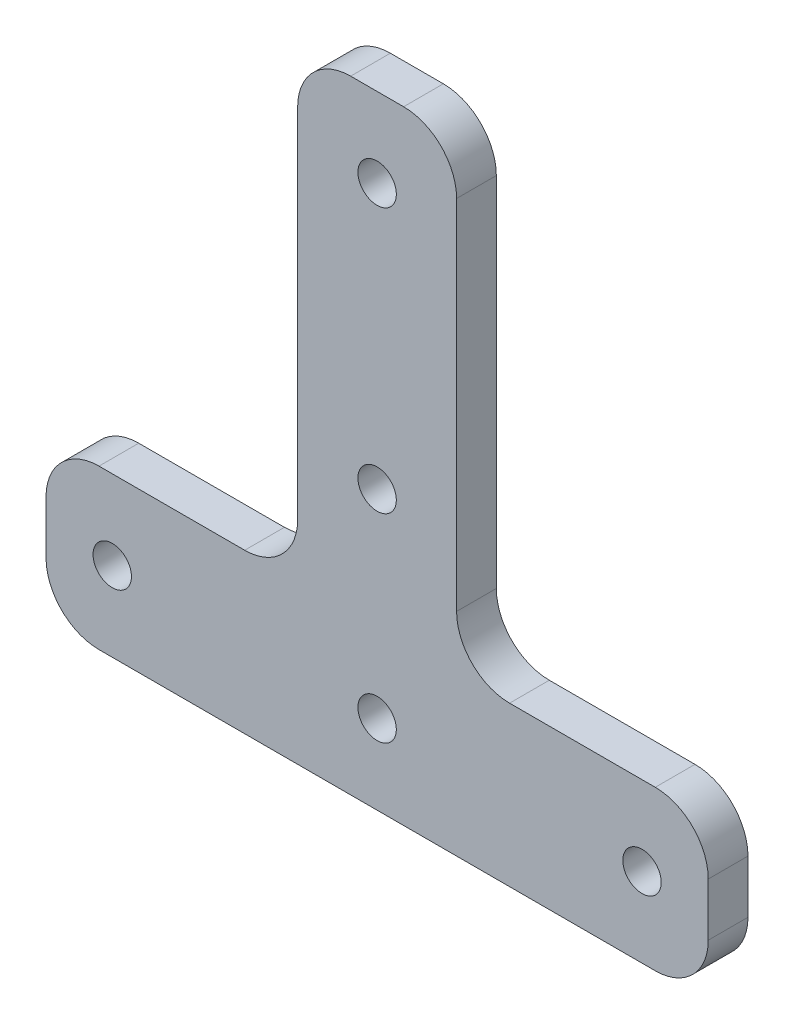
ISO-10303-21;
HEADER;
FILE_DESCRIPTION(('STEP AP214'),'2;1');
FILE_NAME('part.step','',(''),(''),'','','');
FILE_SCHEMA(('AUTOMOTIVE_DESIGN { 1 0 10303 214 1 1 1 1 }'));
ENDSEC;
DATA;
#1=APPLICATION_CONTEXT('core data for automotive mechanical design processes');
#2=APPLICATION_PROTOCOL_DEFINITION('international standard','automotive_design',2000,#1);
#3=PRODUCT_CONTEXT('',#1,'mechanical');
#4=PRODUCT('Part','Part','',(#3));
#5=PRODUCT_RELATED_PRODUCT_CATEGORY('part','',(#4));
#6=PRODUCT_DEFINITION_FORMATION('','',#4);
#7=PRODUCT_DEFINITION_CONTEXT('part definition',#1,'design');
#8=PRODUCT_DEFINITION('design','',#6,#7);
#9=PRODUCT_DEFINITION_SHAPE('','',#8);
#10=(LENGTH_UNIT() NAMED_UNIT(*) SI_UNIT(.MILLI.,.METRE.));
#11=(NAMED_UNIT(*) PLANE_ANGLE_UNIT() SI_UNIT($,.RADIAN.));
#12=(NAMED_UNIT(*) SI_UNIT($,.STERADIAN.) SOLID_ANGLE_UNIT());
#13=UNCERTAINTY_MEASURE_WITH_UNIT(LENGTH_MEASURE(1.E-05),#10,'distance_accuracy_value','');
#14=(GEOMETRIC_REPRESENTATION_CONTEXT(3) GLOBAL_UNCERTAINTY_ASSIGNED_CONTEXT((#13)) GLOBAL_UNIT_ASSIGNED_CONTEXT((#10,
#11,#12)) REPRESENTATION_CONTEXT('',''));
#15=CARTESIAN_POINT('',(0.,0.,0.));
#16=DIRECTION('',(0.,0.,1.));
#17=DIRECTION('',(1.,0.,0.));
#18=AXIS2_PLACEMENT_3D('',#15,#16,#17);
#19=CARTESIAN_POINT('',(0.,0.,3.));
#20=DIRECTION('',(0.,0.,-1.));
#21=DIRECTION('',(-1.,0.,0.));
#22=AXIS2_PLACEMENT_3D('',#19,#20,#21);
#23=PLANE('',#22);
#24=DIRECTION('',(-1.,0.,0.));
#25=VECTOR('',#24,1.);
#26=CARTESIAN_POINT('',(6.,41.,3.));
#27=LINE('',#26,#25);
#28=CARTESIAN_POINT('',(2.,41.,3.));
#29=VERTEX_POINT('',#28);
#30=CARTESIAN_POINT('',(-2.,41.,3.));
#31=VERTEX_POINT('',#30);
#32=EDGE_CURVE('E202',#29,#31,#27,.T.);
#33=ORIENTED_EDGE('',*,*,#32,.T.);
#34=CARTESIAN_POINT('',(-2.,37.,3.));
#35=DIRECTION('',(0.,0.,-1.));
#36=DIRECTION('',(-1.,0.,0.));
#37=AXIS2_PLACEMENT_3D('',#34,#35,#36);
#38=CIRCLE('',#37,4.);
#39=CARTESIAN_POINT('',(-6.,37.,3.));
#40=VERTEX_POINT('',#39);
#41=EDGE_CURVE('E261',#31,#40,#38,.F.);
#42=ORIENTED_EDGE('',*,*,#41,.T.);
#43=DIRECTION('',(0.,-1.,0.));
#44=VECTOR('',#43,1.);
#45=CARTESIAN_POINT('',(-6.,41.,3.));
#46=LINE('',#45,#44);
#47=CARTESIAN_POINT('',(-5.99999999999999,10.,3.));
#48=VERTEX_POINT('',#47);
#49=EDGE_CURVE('E180',#40,#48,#46,.T.);
#50=ORIENTED_EDGE('',*,*,#49,.T.);
#51=CARTESIAN_POINT('',(-9.99999999999999,10.,3.));
#52=DIRECTION('',(0.,0.,-1.));
#53=DIRECTION('',(-1.,0.,0.));
#54=AXIS2_PLACEMENT_3D('',#51,#52,#53);
#55=CIRCLE('',#54,4.);
#56=CARTESIAN_POINT('',(-9.99999999999999,6.,3.));
#57=VERTEX_POINT('',#56);
#58=EDGE_CURVE('E307',#48,#57,#55,.T.);
#59=ORIENTED_EDGE('',*,*,#58,.T.);
#60=DIRECTION('',(-1.,0.,0.));
#61=VECTOR('',#60,1.);
#62=CARTESIAN_POINT('',(-5.99999999999999,6.,3.));
#63=LINE('',#62,#61);
#64=CARTESIAN_POINT('',(-21.,5.99999999999999,3.));
#65=VERTEX_POINT('',#64);
#66=EDGE_CURVE('E341',#57,#65,#63,.T.);
#67=ORIENTED_EDGE('',*,*,#66,.T.);
#68=CARTESIAN_POINT('',(-21.,1.99999999999999,3.));
#69=DIRECTION('',(0.,0.,-1.));
#70=DIRECTION('',(-1.,0.,0.));
#71=AXIS2_PLACEMENT_3D('',#68,#69,#70);
#72=CIRCLE('',#71,4.);
#73=CARTESIAN_POINT('',(-25.,1.99999999999999,3.));
#74=VERTEX_POINT('',#73);
#75=EDGE_CURVE('E246',#65,#74,#72,.F.);
#76=ORIENTED_EDGE('',*,*,#75,.T.);
#77=DIRECTION('',(0.,-1.,0.));
#78=VECTOR('',#77,1.);
#79=CARTESIAN_POINT('',(-25.,5.99999999999999,3.));
#80=LINE('',#79,#78);
#81=CARTESIAN_POINT('',(-25.,-2.00000000000001,3.));
#82=VERTEX_POINT('',#81);
#83=EDGE_CURVE('E337',#74,#82,#80,.T.);
#84=ORIENTED_EDGE('',*,*,#83,.T.);
#85=CARTESIAN_POINT('',(-21.,-2.00000000000001,3.));
#86=DIRECTION('',(0.,0.,-1.));
#87=DIRECTION('',(-1.,0.,0.));
#88=AXIS2_PLACEMENT_3D('',#85,#86,#87);
#89=CIRCLE('',#88,4.);
#90=CARTESIAN_POINT('',(-21.,-6.00000000000001,3.));
#91=VERTEX_POINT('',#90);
#92=EDGE_CURVE('E249',#82,#91,#89,.F.);
#93=ORIENTED_EDGE('',*,*,#92,.T.);
#94=DIRECTION('',(1.,0.,0.));
#95=VECTOR('',#94,1.);
#96=CARTESIAN_POINT('',(-25.,-6.00000000000001,3.));
#97=LINE('',#96,#95);
#98=CARTESIAN_POINT('',(21.,-6.00000000000001,3.));
#99=VERTEX_POINT('',#98);
#100=EDGE_CURVE('E333',#91,#99,#97,.T.);
#101=ORIENTED_EDGE('',*,*,#100,.T.);
#102=CARTESIAN_POINT('',(21.,-2.00000000000001,3.));
#103=DIRECTION('',(0.,0.,-1.));
#104=DIRECTION('',(-1.,0.,0.));
#105=AXIS2_PLACEMENT_3D('',#102,#103,#104);
#106=CIRCLE('',#105,4.);
#107=CARTESIAN_POINT('',(25.,-2.00000000000001,3.));
#108=VERTEX_POINT('',#107);
#109=EDGE_CURVE('E252',#99,#108,#106,.F.);
#110=ORIENTED_EDGE('',*,*,#109,.T.);
#111=DIRECTION('',(0.,1.,0.));
#112=VECTOR('',#111,1.);
#113=CARTESIAN_POINT('',(25.,-6.00000000000001,3.));
#114=LINE('',#113,#112);
#115=CARTESIAN_POINT('',(25.,2.,3.));
#116=VERTEX_POINT('',#115);
#117=EDGE_CURVE('E327',#108,#116,#114,.T.);
#118=ORIENTED_EDGE('',*,*,#117,.T.);
#119=CARTESIAN_POINT('',(21.,2.,3.));
#120=DIRECTION('',(0.,0.,-1.));
#121=DIRECTION('',(-1.,0.,0.));
#122=AXIS2_PLACEMENT_3D('',#119,#120,#121);
#123=CIRCLE('',#122,4.);
#124=CARTESIAN_POINT('',(21.,6.,3.));
#125=VERTEX_POINT('',#124);
#126=EDGE_CURVE('E255',#116,#125,#123,.F.);
#127=ORIENTED_EDGE('',*,*,#126,.T.);
#128=DIRECTION('',(-1.,0.,0.));
#129=VECTOR('',#128,1.);
#130=CARTESIAN_POINT('',(25.,6.,3.));
#131=LINE('',#130,#129);
#132=CARTESIAN_POINT('',(10.,6.,3.));
#133=VERTEX_POINT('',#132);
#134=EDGE_CURVE('E323',#125,#133,#131,.T.);
#135=ORIENTED_EDGE('',*,*,#134,.T.);
#136=CARTESIAN_POINT('',(10.,10.,3.));
#137=DIRECTION('',(0.,0.,-1.));
#138=DIRECTION('',(-1.,0.,0.));
#139=AXIS2_PLACEMENT_3D('',#136,#137,#138);
#140=CIRCLE('',#139,4.);
#141=CARTESIAN_POINT('',(6.,10.,3.));
#142=VERTEX_POINT('',#141);
#143=EDGE_CURVE('E11',#133,#142,#140,.T.);
#144=ORIENTED_EDGE('',*,*,#143,.T.);
#145=DIRECTION('',(0.,1.,0.));
#146=VECTOR('',#145,1.);
#147=CARTESIAN_POINT('',(6.,6.,3.));
#148=LINE('',#147,#146);
#149=CARTESIAN_POINT('',(6.,37.,3.));
#150=VERTEX_POINT('',#149);
#151=EDGE_CURVE('E320',#142,#150,#148,.T.);
#152=ORIENTED_EDGE('',*,*,#151,.T.);
#153=CARTESIAN_POINT('',(2.,37.,3.));
#154=DIRECTION('',(0.,0.,-1.));
#155=DIRECTION('',(-1.,0.,0.));
#156=AXIS2_PLACEMENT_3D('',#153,#154,#155);
#157=CIRCLE('',#156,4.);
#158=EDGE_CURVE('E258',#150,#29,#157,.F.);
#159=ORIENTED_EDGE('',*,*,#158,.T.);
#160=EDGE_LOOP('',(#33,#42,#50,#59,#67,#76,#84,#93,#101,#110,#118,#127,#135,#144,#152,#159));
#161=FACE_BOUND('',#160,.T.);
#162=CARTESIAN_POINT('',(0.,35.,3.));
#163=DIRECTION('',(0.,0.,1.));
#164=DIRECTION('',(1.,0.,0.));
#165=AXIS2_PLACEMENT_3D('',#162,#163,#164);
#166=CIRCLE('',#165,1.45);
#167=CARTESIAN_POINT('',(1.45,35.,3.));
#168=VERTEX_POINT('',#167);
#169=EDGE_CURVE('E191',#168,#168,#166,.T.);
#170=ORIENTED_EDGE('',*,*,#169,.F.);
#171=EDGE_LOOP('',(#170));
#172=FACE_BOUND('',#171,.T.);
#173=CARTESIAN_POINT('',(0.,0.,3.));
#174=DIRECTION('',(0.,0.,1.));
#175=DIRECTION('',(1.,0.,0.));
#176=AXIS2_PLACEMENT_3D('',#173,#174,#175);
#177=CIRCLE('',#176,1.45);
#178=CARTESIAN_POINT('',(1.45,0.,3.));
#179=VERTEX_POINT('',#178);
#180=EDGE_CURVE('E349',#179,#179,#177,.T.);
#181=ORIENTED_EDGE('',*,*,#180,.F.);
#182=EDGE_LOOP('',(#181));
#183=FACE_BOUND('',#182,.T.);
#184=CARTESIAN_POINT('',(-20.,0.,3.));
#185=DIRECTION('',(0.,0.,1.));
#186=DIRECTION('',(1.,0.,0.));
#187=AXIS2_PLACEMENT_3D('',#184,#185,#186);
#188=CIRCLE('',#187,1.45);
#189=CARTESIAN_POINT('',(-18.55,0.,3.));
#190=VERTEX_POINT('',#189);
#191=EDGE_CURVE('E355',#190,#190,#188,.T.);
#192=ORIENTED_EDGE('',*,*,#191,.F.);
#193=EDGE_LOOP('',(#192));
#194=FACE_BOUND('',#193,.T.);
#195=CARTESIAN_POINT('',(20.,0.,3.));
#196=DIRECTION('',(0.,0.,1.));
#197=DIRECTION('',(1.,0.,0.));
#198=AXIS2_PLACEMENT_3D('',#195,#196,#197);
#199=CIRCLE('',#198,1.45);
#200=CARTESIAN_POINT('',(21.45,0.,3.));
#201=VERTEX_POINT('',#200);
#202=EDGE_CURVE('E363',#201,#201,#199,.T.);
#203=ORIENTED_EDGE('',*,*,#202,.F.);
#204=EDGE_LOOP('',(#203));
#205=FACE_BOUND('',#204,.T.);
#206=CARTESIAN_POINT('',(0.,15.,3.));
#207=DIRECTION('',(0.,0.,1.));
#208=DIRECTION('',(1.,0.,0.));
#209=AXIS2_PLACEMENT_3D('',#206,#207,#208);
#210=CIRCLE('',#209,1.45);
#211=CARTESIAN_POINT('',(1.45,15.,3.));
#212=VERTEX_POINT('',#211);
#213=EDGE_CURVE('E371',#212,#212,#210,.T.);
#214=ORIENTED_EDGE('',*,*,#213,.F.);
#215=EDGE_LOOP('',(#214));
#216=FACE_BOUND('',#215,.T.);
#217=ADVANCED_FACE('F45',(#161,#172,#183,#194,#205,#216),#23,.F.);
#218=CARTESIAN_POINT('',(0.,0.,0.));
#219=DIRECTION('',(0.,0.,-1.));
#220=DIRECTION('',(-1.,0.,0.));
#221=AXIS2_PLACEMENT_3D('',#218,#219,#220);
#222=PLANE('',#221);
#223=CARTESIAN_POINT('',(20.,0.,0.));
#224=DIRECTION('',(0.,0.,1.));
#225=DIRECTION('',(1.,0.,0.));
#226=AXIS2_PLACEMENT_3D('',#223,#224,#225);
#227=CIRCLE('',#226,1.45);
#228=CARTESIAN_POINT('',(21.45,0.,0.));
#229=VERTEX_POINT('',#228);
#230=EDGE_CURVE('E367',#229,#229,#227,.T.);
#231=ORIENTED_EDGE('',*,*,#230,.T.);
#232=EDGE_LOOP('',(#231));
#233=FACE_BOUND('',#232,.T.);
#234=CARTESIAN_POINT('',(0.,0.,0.));
#235=DIRECTION('',(0.,0.,1.));
#236=DIRECTION('',(1.,0.,0.));
#237=AXIS2_PLACEMENT_3D('',#234,#235,#236);
#238=CIRCLE('',#237,1.45);
#239=CARTESIAN_POINT('',(1.45,0.,0.));
#240=VERTEX_POINT('',#239);
#241=EDGE_CURVE('E351',#240,#240,#238,.T.);
#242=ORIENTED_EDGE('',*,*,#241,.T.);
#243=EDGE_LOOP('',(#242));
#244=FACE_BOUND('',#243,.T.);
#245=DIRECTION('',(0.,-1.,0.));
#246=VECTOR('',#245,1.);
#247=CARTESIAN_POINT('',(-6.,41.,0.));
#248=LINE('',#247,#246);
#249=CARTESIAN_POINT('',(-6.,37.,0.));
#250=VERTEX_POINT('',#249);
#251=CARTESIAN_POINT('',(-5.99999999999999,10.,0.));
#252=VERTEX_POINT('',#251);
#253=EDGE_CURVE('E177',#250,#252,#248,.T.);
#254=ORIENTED_EDGE('',*,*,#253,.F.);
#255=CARTESIAN_POINT('',(-2.,37.,0.));
#256=DIRECTION('',(0.,0.,-1.));
#257=DIRECTION('',(-1.,0.,0.));
#258=AXIS2_PLACEMENT_3D('',#255,#256,#257);
#259=CIRCLE('',#258,4.);
#260=CARTESIAN_POINT('',(-2.,41.,0.));
#261=VERTEX_POINT('',#260);
#262=EDGE_CURVE('E159',#250,#261,#259,.T.);
#263=ORIENTED_EDGE('',*,*,#262,.T.);
#264=DIRECTION('',(-1.,0.,0.));
#265=VECTOR('',#264,1.);
#266=CARTESIAN_POINT('',(6.,41.,0.));
#267=LINE('',#266,#265);
#268=CARTESIAN_POINT('',(2.,41.,0.));
#269=VERTEX_POINT('',#268);
#270=EDGE_CURVE('E223',#269,#261,#267,.T.);
#271=ORIENTED_EDGE('',*,*,#270,.F.);
#272=CARTESIAN_POINT('',(2.,37.,0.));
#273=DIRECTION('',(0.,0.,-1.));
#274=DIRECTION('',(-1.,0.,0.));
#275=AXIS2_PLACEMENT_3D('',#272,#273,#274);
#276=CIRCLE('',#275,4.);
#277=CARTESIAN_POINT('',(6.,37.,0.));
#278=VERTEX_POINT('',#277);
#279=EDGE_CURVE('E171',#269,#278,#276,.T.);
#280=ORIENTED_EDGE('',*,*,#279,.T.);
#281=DIRECTION('',(0.,1.,0.));
#282=VECTOR('',#281,1.);
#283=CARTESIAN_POINT('',(6.,6.,0.));
#284=LINE('',#283,#282);
#285=CARTESIAN_POINT('',(6.,10.,0.));
#286=VERTEX_POINT('',#285);
#287=EDGE_CURVE('E220',#286,#278,#284,.T.);
#288=ORIENTED_EDGE('',*,*,#287,.F.);
#289=CARTESIAN_POINT('',(10.,10.,0.));
#290=DIRECTION('',(0.,0.,-1.));
#291=DIRECTION('',(-1.,0.,0.));
#292=AXIS2_PLACEMENT_3D('',#289,#290,#291);
#293=CIRCLE('',#292,4.);
#294=CARTESIAN_POINT('',(10.,6.,0.));
#295=VERTEX_POINT('',#294);
#296=EDGE_CURVE('E54',#286,#295,#293,.F.);
#297=ORIENTED_EDGE('',*,*,#296,.T.);
#298=DIRECTION('',(-1.,0.,0.));
#299=VECTOR('',#298,1.);
#300=CARTESIAN_POINT('',(25.,6.,0.));
#301=LINE('',#300,#299);
#302=CARTESIAN_POINT('',(21.,6.,0.));
#303=VERTEX_POINT('',#302);
#304=EDGE_CURVE('E216',#303,#295,#301,.T.);
#305=ORIENTED_EDGE('',*,*,#304,.F.);
#306=CARTESIAN_POINT('',(21.,2.,0.));
#307=DIRECTION('',(0.,0.,-1.));
#308=DIRECTION('',(-1.,0.,0.));
#309=AXIS2_PLACEMENT_3D('',#306,#307,#308);
#310=CIRCLE('',#309,4.);
#311=CARTESIAN_POINT('',(25.,2.,0.));
#312=VERTEX_POINT('',#311);
#313=EDGE_CURVE('E236',#303,#312,#310,.T.);
#314=ORIENTED_EDGE('',*,*,#313,.T.);
#315=DIRECTION('',(0.,1.,0.));
#316=VECTOR('',#315,1.);
#317=CARTESIAN_POINT('',(25.,-6.00000000000001,0.));
#318=LINE('',#317,#316);
#319=CARTESIAN_POINT('',(25.,-2.00000000000001,0.));
#320=VERTEX_POINT('',#319);
#321=EDGE_CURVE('E212',#320,#312,#318,.T.);
#322=ORIENTED_EDGE('',*,*,#321,.F.);
#323=CARTESIAN_POINT('',(21.,-2.00000000000001,0.));
#324=DIRECTION('',(0.,0.,-1.));
#325=DIRECTION('',(-1.,0.,0.));
#326=AXIS2_PLACEMENT_3D('',#323,#324,#325);
#327=CIRCLE('',#326,4.);
#328=CARTESIAN_POINT('',(21.,-6.00000000000001,0.));
#329=VERTEX_POINT('',#328);
#330=EDGE_CURVE('E233',#320,#329,#327,.T.);
#331=ORIENTED_EDGE('',*,*,#330,.T.);
#332=DIRECTION('',(1.,0.,0.));
#333=VECTOR('',#332,1.);
#334=CARTESIAN_POINT('',(-25.,-6.00000000000001,0.));
#335=LINE('',#334,#333);
#336=CARTESIAN_POINT('',(-21.,-6.00000000000001,0.));
#337=VERTEX_POINT('',#336);
#338=EDGE_CURVE('E208',#337,#329,#335,.T.);
#339=ORIENTED_EDGE('',*,*,#338,.F.);
#340=CARTESIAN_POINT('',(-21.,-2.00000000000001,0.));
#341=DIRECTION('',(0.,0.,-1.));
#342=DIRECTION('',(-1.,0.,0.));
#343=AXIS2_PLACEMENT_3D('',#340,#341,#342);
#344=CIRCLE('',#343,4.);
#345=CARTESIAN_POINT('',(-25.,-2.00000000000001,0.));
#346=VERTEX_POINT('',#345);
#347=EDGE_CURVE('E230',#337,#346,#344,.T.);
#348=ORIENTED_EDGE('',*,*,#347,.T.);
#349=DIRECTION('',(0.,-1.,0.));
#350=VECTOR('',#349,1.);
#351=CARTESIAN_POINT('',(-25.,5.99999999999999,0.));
#352=LINE('',#351,#350);
#353=CARTESIAN_POINT('',(-25.,1.99999999999999,0.));
#354=VERTEX_POINT('',#353);
#355=EDGE_CURVE('E196',#354,#346,#352,.T.);
#356=ORIENTED_EDGE('',*,*,#355,.F.);
#357=CARTESIAN_POINT('',(-21.,1.99999999999999,0.));
#358=DIRECTION('',(0.,0.,-1.));
#359=DIRECTION('',(-1.,0.,0.));
#360=AXIS2_PLACEMENT_3D('',#357,#358,#359);
#361=CIRCLE('',#360,4.);
#362=CARTESIAN_POINT('',(-21.,5.99999999999999,0.));
#363=VERTEX_POINT('',#362);
#364=EDGE_CURVE('E182',#354,#363,#361,.T.);
#365=ORIENTED_EDGE('',*,*,#364,.T.);
#366=DIRECTION('',(-1.,0.,0.));
#367=VECTOR('',#366,1.);
#368=CARTESIAN_POINT('',(-5.99999999999999,6.,0.));
#369=LINE('',#368,#367);
#370=CARTESIAN_POINT('',(-9.99999999999999,6.,0.));
#371=VERTEX_POINT('',#370);
#372=EDGE_CURVE('E190',#371,#363,#369,.T.);
#373=ORIENTED_EDGE('',*,*,#372,.F.);
#374=CARTESIAN_POINT('',(-9.99999999999999,10.,0.));
#375=DIRECTION('',(0.,0.,-1.));
#376=DIRECTION('',(-1.,0.,0.));
#377=AXIS2_PLACEMENT_3D('',#374,#375,#376);
#378=CIRCLE('',#377,4.);
#379=EDGE_CURVE('E188',#371,#252,#378,.F.);
#380=ORIENTED_EDGE('',*,*,#379,.T.);
#381=EDGE_LOOP('',(#254,#263,#271,#280,#288,#297,#305,#314,#322,#331,#339,#348,#356,#365,#373,#380));
#382=FACE_BOUND('',#381,.T.);
#383=CARTESIAN_POINT('',(0.,35.,0.));
#384=DIRECTION('',(0.,0.,1.));
#385=DIRECTION('',(1.,0.,0.));
#386=AXIS2_PLACEMENT_3D('',#383,#384,#385);
#387=CIRCLE('',#386,1.45);
#388=CARTESIAN_POINT('',(1.45,35.,0.));
#389=VERTEX_POINT('',#388);
#390=EDGE_CURVE('E199',#389,#389,#387,.T.);
#391=ORIENTED_EDGE('',*,*,#390,.T.);
#392=EDGE_LOOP('',(#391));
#393=FACE_BOUND('',#392,.T.);
#394=CARTESIAN_POINT('',(-20.,0.,0.));
#395=DIRECTION('',(0.,0.,1.));
#396=DIRECTION('',(1.,0.,0.));
#397=AXIS2_PLACEMENT_3D('',#394,#395,#396);
#398=CIRCLE('',#397,1.45);
#399=CARTESIAN_POINT('',(-18.55,0.,0.));
#400=VERTEX_POINT('',#399);
#401=EDGE_CURVE('E359',#400,#400,#398,.T.);
#402=ORIENTED_EDGE('',*,*,#401,.T.);
#403=EDGE_LOOP('',(#402));
#404=FACE_BOUND('',#403,.T.);
#405=CARTESIAN_POINT('',(0.,15.,0.));
#406=DIRECTION('',(0.,0.,1.));
#407=DIRECTION('',(1.,0.,0.));
#408=AXIS2_PLACEMENT_3D('',#405,#406,#407);
#409=CIRCLE('',#408,1.45);
#410=CARTESIAN_POINT('',(1.45,15.,0.));
#411=VERTEX_POINT('',#410);
#412=EDGE_CURVE('E375',#411,#411,#409,.T.);
#413=ORIENTED_EDGE('',*,*,#412,.T.);
#414=EDGE_LOOP('',(#413));
#415=FACE_BOUND('',#414,.T.);
#416=ADVANCED_FACE('F185',(#233,#244,#382,#393,#404,#415),#222,.T.);
#417=CARTESIAN_POINT('',(-6.,41.,3.));
#418=DIRECTION('',(1.,0.,0.));
#419=DIRECTION('',(0.,1.,0.));
#420=AXIS2_PLACEMENT_3D('',#417,#418,#419);
#421=PLANE('',#420);
#422=ORIENTED_EDGE('',*,*,#49,.F.);
#423=DIRECTION('',(0.,0.,-1.));
#424=VECTOR('',#423,1.);
#425=CARTESIAN_POINT('',(-6.,37.,3.));
#426=LINE('',#425,#424);
#427=EDGE_CURVE('E163',#40,#250,#426,.T.);
#428=ORIENTED_EDGE('',*,*,#427,.T.);
#429=ORIENTED_EDGE('',*,*,#253,.T.);
#430=DIRECTION('',(0.,0.,-1.));
#431=VECTOR('',#430,1.);
#432=CARTESIAN_POINT('',(-5.99999999999999,10.,3.));
#433=LINE('',#432,#431);
#434=EDGE_CURVE('E183',#252,#48,#433,.F.);
#435=ORIENTED_EDGE('',*,*,#434,.T.);
#436=EDGE_LOOP('',(#422,#428,#429,#435));
#437=FACE_BOUND('',#436,.T.);
#438=ADVANCED_FACE('F176',(#437),#421,.F.);
#439=CARTESIAN_POINT('',(-5.99999999999999,6.,3.));
#440=DIRECTION('',(0.,-1.,0.));
#441=DIRECTION('',(1.,0.,0.));
#442=AXIS2_PLACEMENT_3D('',#439,#440,#441);
#443=PLANE('',#442);
#444=ORIENTED_EDGE('',*,*,#372,.T.);
#445=DIRECTION('',(0.,0.,-1.));
#446=VECTOR('',#445,1.);
#447=CARTESIAN_POINT('',(-21.,5.99999999999999,3.));
#448=LINE('',#447,#446);
#449=EDGE_CURVE('E302',#363,#65,#448,.F.);
#450=ORIENTED_EDGE('',*,*,#449,.T.);
#451=ORIENTED_EDGE('',*,*,#66,.F.);
#452=DIRECTION('',(0.,0.,-1.));
#453=VECTOR('',#452,1.);
#454=CARTESIAN_POINT('',(-9.99999999999999,6.,0.));
#455=LINE('',#454,#453);
#456=EDGE_CURVE('E298',#57,#371,#455,.T.);
#457=ORIENTED_EDGE('',*,*,#456,.T.);
#458=EDGE_LOOP('',(#444,#450,#451,#457));
#459=FACE_BOUND('',#458,.T.);
#460=ADVANCED_FACE('F418',(#459),#443,.F.);
#461=CARTESIAN_POINT('',(-25.,5.99999999999999,3.));
#462=DIRECTION('',(1.,0.,0.));
#463=DIRECTION('',(0.,0.,-1.));
#464=AXIS2_PLACEMENT_3D('',#461,#462,#463);
#465=PLANE('',#464);
#466=ORIENTED_EDGE('',*,*,#355,.T.);
#467=DIRECTION('',(0.,0.,-1.));
#468=VECTOR('',#467,1.);
#469=CARTESIAN_POINT('',(-25.,-2.00000000000001,3.));
#470=LINE('',#469,#468);
#471=EDGE_CURVE('E295',#346,#82,#470,.F.);
#472=ORIENTED_EDGE('',*,*,#471,.T.);
#473=ORIENTED_EDGE('',*,*,#83,.F.);
#474=DIRECTION('',(0.,0.,-1.));
#475=VECTOR('',#474,1.);
#476=CARTESIAN_POINT('',(-25.,1.99999999999999,3.));
#477=LINE('',#476,#475);
#478=EDGE_CURVE('E291',#74,#354,#477,.T.);
#479=ORIENTED_EDGE('',*,*,#478,.T.);
#480=EDGE_LOOP('',(#466,#472,#473,#479));
#481=FACE_BOUND('',#480,.T.);
#482=ADVANCED_FACE('F414',(#481),#465,.F.);
#483=CARTESIAN_POINT('',(-25.,-6.00000000000001,3.));
#484=DIRECTION('',(0.,1.,0.));
#485=DIRECTION('',(0.,0.,1.));
#486=AXIS2_PLACEMENT_3D('',#483,#484,#485);
#487=PLANE('',#486);
#488=ORIENTED_EDGE('',*,*,#338,.T.);
#489=DIRECTION('',(0.,0.,-1.));
#490=VECTOR('',#489,1.);
#491=CARTESIAN_POINT('',(21.,-6.00000000000001,3.));
#492=LINE('',#491,#490);
#493=EDGE_CURVE('E288',#329,#99,#492,.F.);
#494=ORIENTED_EDGE('',*,*,#493,.T.);
#495=ORIENTED_EDGE('',*,*,#100,.F.);
#496=DIRECTION('',(0.,0.,-1.));
#497=VECTOR('',#496,1.);
#498=CARTESIAN_POINT('',(-21.,-6.00000000000001,3.));
#499=LINE('',#498,#497);
#500=EDGE_CURVE('E284',#91,#337,#499,.T.);
#501=ORIENTED_EDGE('',*,*,#500,.T.);
#502=EDGE_LOOP('',(#488,#494,#495,#501));
#503=FACE_BOUND('',#502,.T.);
#504=ADVANCED_FACE('F410',(#503),#487,.F.);
#505=CARTESIAN_POINT('',(25.,-6.00000000000001,3.));
#506=DIRECTION('',(-1.,0.,0.));
#507=DIRECTION('',(0.,0.,1.));
#508=AXIS2_PLACEMENT_3D('',#505,#506,#507);
#509=PLANE('',#508);
#510=ORIENTED_EDGE('',*,*,#321,.T.);
#511=DIRECTION('',(0.,0.,-1.));
#512=VECTOR('',#511,1.);
#513=CARTESIAN_POINT('',(25.,2.,3.));
#514=LINE('',#513,#512);
#515=EDGE_CURVE('E281',#312,#116,#514,.F.);
#516=ORIENTED_EDGE('',*,*,#515,.T.);
#517=ORIENTED_EDGE('',*,*,#117,.F.);
#518=DIRECTION('',(0.,0.,-1.));
#519=VECTOR('',#518,1.);
#520=CARTESIAN_POINT('',(25.,-2.00000000000001,3.));
#521=LINE('',#520,#519);
#522=EDGE_CURVE('E277',#108,#320,#521,.T.);
#523=ORIENTED_EDGE('',*,*,#522,.T.);
#524=EDGE_LOOP('',(#510,#516,#517,#523));
#525=FACE_BOUND('',#524,.T.);
#526=ADVANCED_FACE('F407',(#525),#509,.F.);
#527=CARTESIAN_POINT('',(25.,6.,3.));
#528=DIRECTION('',(0.,-1.,0.));
#529=DIRECTION('',(1.,0.,0.));
#530=AXIS2_PLACEMENT_3D('',#527,#528,#529);
#531=PLANE('',#530);
#532=ORIENTED_EDGE('',*,*,#134,.F.);
#533=DIRECTION('',(0.,0.,-1.));
#534=VECTOR('',#533,1.);
#535=CARTESIAN_POINT('',(21.,6.,3.));
#536=LINE('',#535,#534);
#537=EDGE_CURVE('E273',#125,#303,#536,.T.);
#538=ORIENTED_EDGE('',*,*,#537,.T.);
#539=ORIENTED_EDGE('',*,*,#304,.T.);
#540=DIRECTION('',(0.,0.,-1.));
#541=VECTOR('',#540,1.);
#542=CARTESIAN_POINT('',(10.,6.,3.));
#543=LINE('',#542,#541);
#544=EDGE_CURVE('E270',#295,#133,#543,.F.);
#545=ORIENTED_EDGE('',*,*,#544,.T.);
#546=EDGE_LOOP('',(#532,#538,#539,#545));
#547=FACE_BOUND('',#546,.T.);
#548=ADVANCED_FACE('F317',(#547),#531,.F.);
#549=CARTESIAN_POINT('',(6.,6.,3.));
#550=DIRECTION('',(-1.,0.,0.));
#551=DIRECTION('',(0.,-1.,0.));
#552=AXIS2_PLACEMENT_3D('',#549,#550,#551);
#553=PLANE('',#552);
#554=ORIENTED_EDGE('',*,*,#287,.T.);
#555=DIRECTION('',(0.,0.,-1.));
#556=VECTOR('',#555,1.);
#557=CARTESIAN_POINT('',(6.,37.,3.));
#558=LINE('',#557,#556);
#559=EDGE_CURVE('E61',#278,#150,#558,.F.);
#560=ORIENTED_EDGE('',*,*,#559,.T.);
#561=ORIENTED_EDGE('',*,*,#151,.F.);
#562=DIRECTION('',(0.,0.,-1.));
#563=VECTOR('',#562,1.);
#564=CARTESIAN_POINT('',(6.,10.,0.));
#565=LINE('',#564,#563);
#566=EDGE_CURVE('E264',#142,#286,#565,.T.);
#567=ORIENTED_EDGE('',*,*,#566,.T.);
#568=EDGE_LOOP('',(#554,#560,#561,#567));
#569=FACE_BOUND('',#568,.T.);
#570=ADVANCED_FACE('F319',(#569),#553,.F.);
#571=CARTESIAN_POINT('',(6.,41.,3.));
#572=DIRECTION('',(0.,-1.,0.));
#573=DIRECTION('',(0.,0.,-1.));
#574=AXIS2_PLACEMENT_3D('',#571,#572,#573);
#575=PLANE('',#574);
#576=ORIENTED_EDGE('',*,*,#270,.T.);
#577=DIRECTION('',(0.,0.,-1.));
#578=VECTOR('',#577,1.);
#579=CARTESIAN_POINT('',(-2.,41.,3.));
#580=LINE('',#579,#578);
#581=EDGE_CURVE('E164',#261,#31,#580,.F.);
#582=ORIENTED_EDGE('',*,*,#581,.T.);
#583=ORIENTED_EDGE('',*,*,#32,.F.);
#584=DIRECTION('',(0.,0.,-1.));
#585=VECTOR('',#584,1.);
#586=CARTESIAN_POINT('',(2.,41.,3.));
#587=LINE('',#586,#585);
#588=EDGE_CURVE('E170',#29,#269,#587,.T.);
#589=ORIENTED_EDGE('',*,*,#588,.T.);
#590=EDGE_LOOP('',(#576,#582,#583,#589));
#591=FACE_BOUND('',#590,.T.);
#592=ADVANCED_FACE('F399',(#591),#575,.F.);
#593=CARTESIAN_POINT('',(0.,35.,3.));
#594=DIRECTION('',(0.,0.,-1.));
#595=DIRECTION('',(-1.,0.,0.));
#596=AXIS2_PLACEMENT_3D('',#593,#594,#595);
#597=CYLINDRICAL_SURFACE('',#596,1.45);
#598=ORIENTED_EDGE('',*,*,#169,.T.);
#599=EDGE_LOOP('',(#598));
#600=FACE_BOUND('',#599,.T.);
#601=ORIENTED_EDGE('',*,*,#390,.F.);
#602=EDGE_LOOP('',(#601));
#603=FACE_BOUND('',#602,.T.);
#604=ADVANCED_FACE('F396',(#600,#603),#597,.F.);
#605=CARTESIAN_POINT('',(0.,0.,3.));
#606=DIRECTION('',(0.,0.,-1.));
#607=DIRECTION('',(-1.,0.,0.));
#608=AXIS2_PLACEMENT_3D('',#605,#606,#607);
#609=CYLINDRICAL_SURFACE('',#608,1.45);
#610=ORIENTED_EDGE('',*,*,#180,.T.);
#611=EDGE_LOOP('',(#610));
#612=FACE_BOUND('',#611,.T.);
#613=ORIENTED_EDGE('',*,*,#241,.F.);
#614=EDGE_LOOP('',(#613));
#615=FACE_BOUND('',#614,.T.);
#616=ADVANCED_FACE('F544',(#612,#615),#609,.F.);
#617=CARTESIAN_POINT('',(-20.,0.,3.));
#618=DIRECTION('',(0.,0.,-1.));
#619=DIRECTION('',(-1.,0.,0.));
#620=AXIS2_PLACEMENT_3D('',#617,#618,#619);
#621=CYLINDRICAL_SURFACE('',#620,1.45);
#622=ORIENTED_EDGE('',*,*,#191,.T.);
#623=EDGE_LOOP('',(#622));
#624=FACE_BOUND('',#623,.T.);
#625=ORIENTED_EDGE('',*,*,#401,.F.);
#626=EDGE_LOOP('',(#625));
#627=FACE_BOUND('',#626,.T.);
#628=ADVANCED_FACE('F534',(#624,#627),#621,.F.);
#629=CARTESIAN_POINT('',(20.,0.,3.));
#630=DIRECTION('',(0.,0.,-1.));
#631=DIRECTION('',(-1.,0.,0.));
#632=AXIS2_PLACEMENT_3D('',#629,#630,#631);
#633=CYLINDRICAL_SURFACE('',#632,1.45);
#634=ORIENTED_EDGE('',*,*,#202,.T.);
#635=EDGE_LOOP('',(#634));
#636=FACE_BOUND('',#635,.T.);
#637=ORIENTED_EDGE('',*,*,#230,.F.);
#638=EDGE_LOOP('',(#637));
#639=FACE_BOUND('',#638,.T.);
#640=ADVANCED_FACE('F525',(#636,#639),#633,.F.);
#641=CARTESIAN_POINT('',(0.,15.,3.));
#642=DIRECTION('',(0.,0.,-1.));
#643=DIRECTION('',(-1.,0.,0.));
#644=AXIS2_PLACEMENT_3D('',#641,#642,#643);
#645=CYLINDRICAL_SURFACE('',#644,1.45);
#646=ORIENTED_EDGE('',*,*,#213,.T.);
#647=EDGE_LOOP('',(#646));
#648=FACE_BOUND('',#647,.T.);
#649=ORIENTED_EDGE('',*,*,#412,.F.);
#650=EDGE_LOOP('',(#649));
#651=FACE_BOUND('',#650,.T.);
#652=ADVANCED_FACE('F383',(#648,#651),#645,.F.);
#653=CARTESIAN_POINT('',(-2.,37.,3.));
#654=DIRECTION('',(0.,0.,-1.));
#655=DIRECTION('',(-1.,0.,0.));
#656=AXIS2_PLACEMENT_3D('',#653,#654,#655);
#657=CYLINDRICAL_SURFACE('',#656,4.);
#658=ORIENTED_EDGE('',*,*,#41,.F.);
#659=ORIENTED_EDGE('',*,*,#581,.F.);
#660=ORIENTED_EDGE('',*,*,#262,.F.);
#661=ORIENTED_EDGE('',*,*,#427,.F.);
#662=EDGE_LOOP('',(#658,#659,#660,#661));
#663=FACE_BOUND('',#662,.T.);
#664=ADVANCED_FACE('F162',(#663),#657,.T.);
#665=CARTESIAN_POINT('',(2.,37.,3.));
#666=DIRECTION('',(0.,0.,-1.));
#667=DIRECTION('',(-1.,0.,0.));
#668=AXIS2_PLACEMENT_3D('',#665,#666,#667);
#669=CYLINDRICAL_SURFACE('',#668,4.);
#670=ORIENTED_EDGE('',*,*,#158,.F.);
#671=ORIENTED_EDGE('',*,*,#559,.F.);
#672=ORIENTED_EDGE('',*,*,#279,.F.);
#673=ORIENTED_EDGE('',*,*,#588,.F.);
#674=EDGE_LOOP('',(#670,#671,#672,#673));
#675=FACE_BOUND('',#674,.T.);
#676=ADVANCED_FACE('F427',(#675),#669,.T.);
#677=CARTESIAN_POINT('',(21.,2.,3.));
#678=DIRECTION('',(0.,0.,-1.));
#679=DIRECTION('',(-1.,0.,0.));
#680=AXIS2_PLACEMENT_3D('',#677,#678,#679);
#681=CYLINDRICAL_SURFACE('',#680,4.);
#682=ORIENTED_EDGE('',*,*,#126,.F.);
#683=ORIENTED_EDGE('',*,*,#515,.F.);
#684=ORIENTED_EDGE('',*,*,#313,.F.);
#685=ORIENTED_EDGE('',*,*,#537,.F.);
#686=EDGE_LOOP('',(#682,#683,#684,#685));
#687=FACE_BOUND('',#686,.T.);
#688=ADVANCED_FACE('F430',(#687),#681,.T.);
#689=CARTESIAN_POINT('',(21.,-2.00000000000001,3.));
#690=DIRECTION('',(0.,0.,-1.));
#691=DIRECTION('',(-1.,0.,0.));
#692=AXIS2_PLACEMENT_3D('',#689,#690,#691);
#693=CYLINDRICAL_SURFACE('',#692,4.);
#694=ORIENTED_EDGE('',*,*,#109,.F.);
#695=ORIENTED_EDGE('',*,*,#493,.F.);
#696=ORIENTED_EDGE('',*,*,#330,.F.);
#697=ORIENTED_EDGE('',*,*,#522,.F.);
#698=EDGE_LOOP('',(#694,#695,#696,#697));
#699=FACE_BOUND('',#698,.T.);
#700=ADVANCED_FACE('F434',(#699),#693,.T.);
#701=CARTESIAN_POINT('',(-21.,-2.00000000000001,3.));
#702=DIRECTION('',(0.,0.,-1.));
#703=DIRECTION('',(-1.,0.,0.));
#704=AXIS2_PLACEMENT_3D('',#701,#702,#703);
#705=CYLINDRICAL_SURFACE('',#704,4.);
#706=ORIENTED_EDGE('',*,*,#92,.F.);
#707=ORIENTED_EDGE('',*,*,#471,.F.);
#708=ORIENTED_EDGE('',*,*,#347,.F.);
#709=ORIENTED_EDGE('',*,*,#500,.F.);
#710=EDGE_LOOP('',(#706,#707,#708,#709));
#711=FACE_BOUND('',#710,.T.);
#712=ADVANCED_FACE('F438',(#711),#705,.T.);
#713=CARTESIAN_POINT('',(-21.,1.99999999999999,3.));
#714=DIRECTION('',(0.,0.,-1.));
#715=DIRECTION('',(-1.,0.,0.));
#716=AXIS2_PLACEMENT_3D('',#713,#714,#715);
#717=CYLINDRICAL_SURFACE('',#716,4.);
#718=ORIENTED_EDGE('',*,*,#75,.F.);
#719=ORIENTED_EDGE('',*,*,#449,.F.);
#720=ORIENTED_EDGE('',*,*,#364,.F.);
#721=ORIENTED_EDGE('',*,*,#478,.F.);
#722=EDGE_LOOP('',(#718,#719,#720,#721));
#723=FACE_BOUND('',#722,.T.);
#724=ADVANCED_FACE('F442',(#723),#717,.T.);
#725=CARTESIAN_POINT('',(-9.99999999999999,10.,3.));
#726=DIRECTION('',(0.,0.,1.));
#727=DIRECTION('',(1.,0.,0.));
#728=AXIS2_PLACEMENT_3D('',#725,#726,#727);
#729=CYLINDRICAL_SURFACE('',#728,4.);
#730=ORIENTED_EDGE('',*,*,#58,.F.);
#731=ORIENTED_EDGE('',*,*,#434,.F.);
#732=ORIENTED_EDGE('',*,*,#379,.F.);
#733=ORIENTED_EDGE('',*,*,#456,.F.);
#734=EDGE_LOOP('',(#730,#731,#732,#733));
#735=FACE_BOUND('',#734,.T.);
#736=ADVANCED_FACE('F445',(#735),#729,.F.);
#737=CARTESIAN_POINT('',(10.,10.,3.));
#738=DIRECTION('',(0.,0.,1.));
#739=DIRECTION('',(1.,0.,0.));
#740=AXIS2_PLACEMENT_3D('',#737,#738,#739);
#741=CYLINDRICAL_SURFACE('',#740,4.);
#742=ORIENTED_EDGE('',*,*,#143,.F.);
#743=ORIENTED_EDGE('',*,*,#544,.F.);
#744=ORIENTED_EDGE('',*,*,#296,.F.);
#745=ORIENTED_EDGE('',*,*,#566,.F.);
#746=EDGE_LOOP('',(#742,#743,#744,#745));
#747=FACE_BOUND('',#746,.T.);
#748=ADVANCED_FACE('F47',(#747),#741,.F.);
#749=CLOSED_SHELL('',(#217,#416,#438,#460,#482,#504,#526,#548,#570,#592,#604,#616,#628,#640,
#652,#664,#676,#688,#700,#712,#724,#736,#748));
#750=MANIFOLD_SOLID_BREP('B2',#749);
#751=ADVANCED_BREP_SHAPE_REPRESENTATION('',(#18,#750),#14);
#752=SHAPE_DEFINITION_REPRESENTATION(#9,#751);
ENDSEC;
END-ISO-10303-21;
